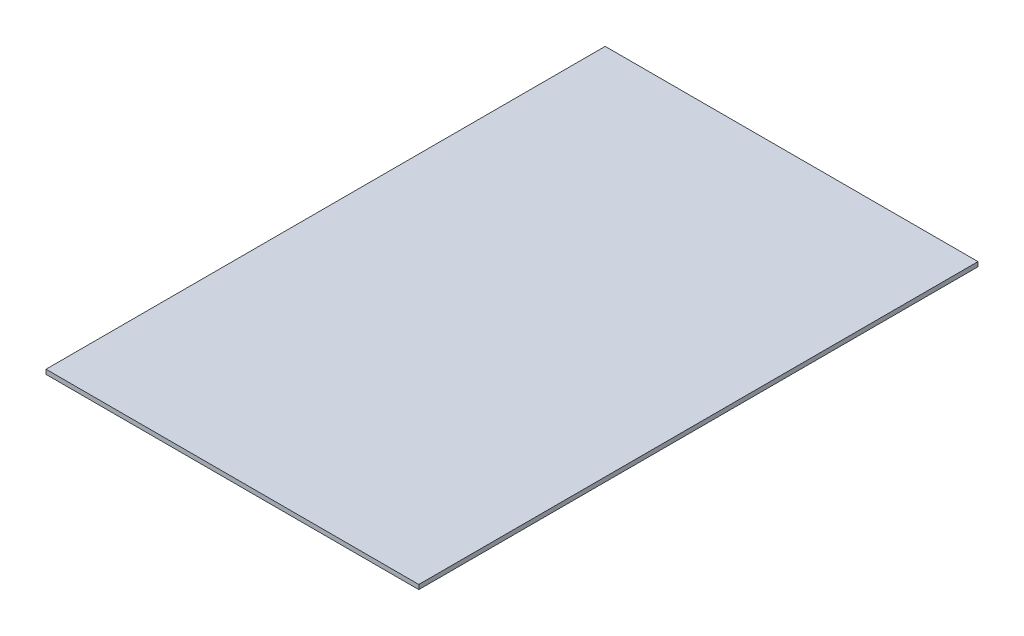
ISO-10303-21;
HEADER;
FILE_DESCRIPTION(('STEP AP214'),'2;1');
FILE_NAME('part.step','',(''),(''),'','','');
FILE_SCHEMA(('AUTOMOTIVE_DESIGN { 1 0 10303 214 1 1 1 1 }'));
ENDSEC;
DATA;
#1=APPLICATION_CONTEXT('core data for automotive mechanical design processes');
#2=APPLICATION_PROTOCOL_DEFINITION('international standard','automotive_design',2000,#1);
#3=PRODUCT_CONTEXT('',#1,'mechanical');
#4=PRODUCT('Part','Part','',(#3));
#5=PRODUCT_RELATED_PRODUCT_CATEGORY('part','',(#4));
#6=PRODUCT_DEFINITION_FORMATION('','',#4);
#7=PRODUCT_DEFINITION_CONTEXT('part definition',#1,'design');
#8=PRODUCT_DEFINITION('design','',#6,#7);
#9=PRODUCT_DEFINITION_SHAPE('','',#8);
#10=(LENGTH_UNIT() NAMED_UNIT(*) SI_UNIT(.MILLI.,.METRE.));
#11=(NAMED_UNIT(*) PLANE_ANGLE_UNIT() SI_UNIT($,.RADIAN.));
#12=(NAMED_UNIT(*) SI_UNIT($,.STERADIAN.) SOLID_ANGLE_UNIT());
#13=UNCERTAINTY_MEASURE_WITH_UNIT(LENGTH_MEASURE(1.E-05),#10,'distance_accuracy_value','');
#14=(GEOMETRIC_REPRESENTATION_CONTEXT(3) GLOBAL_UNCERTAINTY_ASSIGNED_CONTEXT((#13)) GLOBAL_UNIT_ASSIGNED_CONTEXT((#10,
#11,#12)) REPRESENTATION_CONTEXT('',''));
#15=CARTESIAN_POINT('',(0.,0.,0.));
#16=DIRECTION('',(0.,0.,1.));
#17=DIRECTION('',(1.,0.,0.));
#18=AXIS2_PLACEMENT_3D('',#15,#16,#17);
#19=CARTESIAN_POINT('',(0.,4.826,0.));
#20=DIRECTION('',(1.,0.,0.));
#21=DIRECTION('',(0.,0.,-1.));
#22=AXIS2_PLACEMENT_3D('',#19,#20,#21);
#23=PLANE('',#22);
#24=DIRECTION('',(0.,0.,1.));
#25=VECTOR('',#24,1.);
#26=CARTESIAN_POINT('',(0.,0.,0.));
#27=LINE('',#26,#25);
#28=CARTESIAN_POINT('',(0.,0.,0.));
#29=VERTEX_POINT('',#28);
#30=CARTESIAN_POINT('',(0.,0.,600.));
#31=VERTEX_POINT('',#30);
#32=EDGE_CURVE('E105',#29,#31,#27,.T.);
#33=ORIENTED_EDGE('',*,*,#32,.T.);
#34=DIRECTION('',(0.,-1.,0.));
#35=VECTOR('',#34,1.);
#36=CARTESIAN_POINT('',(0.,4.826,600.));
#37=LINE('',#36,#35);
#38=CARTESIAN_POINT('',(0.,4.826,600.));
#39=VERTEX_POINT('',#38);
#40=EDGE_CURVE('E11',#39,#31,#37,.T.);
#41=ORIENTED_EDGE('',*,*,#40,.F.);
#42=DIRECTION('',(0.,0.,1.));
#43=VECTOR('',#42,1.);
#44=CARTESIAN_POINT('',(0.,4.826,0.));
#45=LINE('',#44,#43);
#46=CARTESIAN_POINT('',(0.,4.826,0.));
#47=VERTEX_POINT('',#46);
#48=EDGE_CURVE('E93',#47,#39,#45,.T.);
#49=ORIENTED_EDGE('',*,*,#48,.F.);
#50=DIRECTION('',(0.,-1.,0.));
#51=VECTOR('',#50,1.);
#52=CARTESIAN_POINT('',(0.,4.826,0.));
#53=LINE('',#52,#51);
#54=EDGE_CURVE('E101',#47,#29,#53,.T.);
#55=ORIENTED_EDGE('',*,*,#54,.T.);
#56=EDGE_LOOP('',(#33,#41,#49,#55));
#57=FACE_BOUND('',#56,.T.);
#58=ADVANCED_FACE('F42',(#57),#23,.F.);
#59=CARTESIAN_POINT('',(0.,4.826,600.));
#60=DIRECTION('',(0.,0.,-1.));
#61=DIRECTION('',(-1.,0.,0.));
#62=AXIS2_PLACEMENT_3D('',#59,#60,#61);
#63=PLANE('',#62);
#64=DIRECTION('',(1.,0.,0.));
#65=VECTOR('',#64,1.);
#66=CARTESIAN_POINT('',(0.,0.,600.));
#67=LINE('',#66,#65);
#68=CARTESIAN_POINT('',(400.,0.,600.));
#69=VERTEX_POINT('',#68);
#70=EDGE_CURVE('E97',#31,#69,#67,.T.);
#71=ORIENTED_EDGE('',*,*,#70,.T.);
#72=DIRECTION('',(0.,-1.,0.));
#73=VECTOR('',#72,1.);
#74=CARTESIAN_POINT('',(400.,4.826,600.));
#75=LINE('',#74,#73);
#76=CARTESIAN_POINT('',(400.,4.826,600.));
#77=VERTEX_POINT('',#76);
#78=EDGE_CURVE('E50',#77,#69,#75,.T.);
#79=ORIENTED_EDGE('',*,*,#78,.F.);
#80=DIRECTION('',(1.,0.,0.));
#81=VECTOR('',#80,1.);
#82=CARTESIAN_POINT('',(0.,4.826,600.));
#83=LINE('',#82,#81);
#84=EDGE_CURVE('E88',#39,#77,#83,.T.);
#85=ORIENTED_EDGE('',*,*,#84,.F.);
#86=ORIENTED_EDGE('',*,*,#40,.T.);
#87=EDGE_LOOP('',(#71,#79,#85,#86));
#88=FACE_BOUND('',#87,.T.);
#89=ADVANCED_FACE('F96',(#88),#63,.F.);
#90=CARTESIAN_POINT('',(400.,4.826,0.));
#91=DIRECTION('',(-1.,0.,0.));
#92=DIRECTION('',(0.,0.,1.));
#93=AXIS2_PLACEMENT_3D('',#90,#91,#92);
#94=PLANE('',#93);
#95=DIRECTION('',(0.,0.,-1.));
#96=VECTOR('',#95,1.);
#97=CARTESIAN_POINT('',(400.,0.,0.));
#98=LINE('',#97,#96);
#99=CARTESIAN_POINT('',(400.,0.,0.));
#100=VERTEX_POINT('',#99);
#101=EDGE_CURVE('E75',#69,#100,#98,.T.);
#102=ORIENTED_EDGE('',*,*,#101,.T.);
#103=DIRECTION('',(0.,-1.,0.));
#104=VECTOR('',#103,1.);
#105=CARTESIAN_POINT('',(400.,4.826,0.));
#106=LINE('',#105,#104);
#107=CARTESIAN_POINT('',(400.,4.826,0.));
#108=VERTEX_POINT('',#107);
#109=EDGE_CURVE('E98',#108,#100,#106,.T.);
#110=ORIENTED_EDGE('',*,*,#109,.F.);
#111=DIRECTION('',(0.,0.,-1.));
#112=VECTOR('',#111,1.);
#113=CARTESIAN_POINT('',(400.,4.826,0.));
#114=LINE('',#113,#112);
#115=EDGE_CURVE('E91',#77,#108,#114,.T.);
#116=ORIENTED_EDGE('',*,*,#115,.F.);
#117=ORIENTED_EDGE('',*,*,#78,.T.);
#118=EDGE_LOOP('',(#102,#110,#116,#117));
#119=FACE_BOUND('',#118,.T.);
#120=ADVANCED_FACE('F99',(#119),#94,.F.);
#121=CARTESIAN_POINT('',(0.,4.826,0.));
#122=DIRECTION('',(0.,0.,1.));
#123=DIRECTION('',(1.,0.,0.));
#124=AXIS2_PLACEMENT_3D('',#121,#122,#123);
#125=PLANE('',#124);
#126=DIRECTION('',(-1.,0.,0.));
#127=VECTOR('',#126,1.);
#128=CARTESIAN_POINT('',(0.,0.,0.));
#129=LINE('',#128,#127);
#130=EDGE_CURVE('E81',#100,#29,#129,.T.);
#131=ORIENTED_EDGE('',*,*,#130,.T.);
#132=ORIENTED_EDGE('',*,*,#54,.F.);
#133=DIRECTION('',(-1.,0.,0.));
#134=VECTOR('',#133,1.);
#135=CARTESIAN_POINT('',(0.,4.826,0.));
#136=LINE('',#135,#134);
#137=EDGE_CURVE('E58',#108,#47,#136,.T.);
#138=ORIENTED_EDGE('',*,*,#137,.F.);
#139=ORIENTED_EDGE('',*,*,#109,.T.);
#140=EDGE_LOOP('',(#131,#132,#138,#139));
#141=FACE_BOUND('',#140,.T.);
#142=ADVANCED_FACE('F112',(#141),#125,.F.);
#143=CARTESIAN_POINT('',(0.,4.826,0.));
#144=DIRECTION('',(0.,1.,0.));
#145=DIRECTION('',(0.,0.,1.));
#146=AXIS2_PLACEMENT_3D('',#143,#144,#145);
#147=PLANE('',#146);
#148=ORIENTED_EDGE('',*,*,#48,.T.);
#149=ORIENTED_EDGE('',*,*,#84,.T.);
#150=ORIENTED_EDGE('',*,*,#115,.T.);
#151=ORIENTED_EDGE('',*,*,#137,.T.);
#152=EDGE_LOOP('',(#148,#149,#150,#151));
#153=FACE_BOUND('',#152,.T.);
#154=ADVANCED_FACE('F89',(#153),#147,.T.);
#155=CARTESIAN_POINT('',(0.,0.,0.));
#156=DIRECTION('',(0.,1.,0.));
#157=DIRECTION('',(0.,0.,1.));
#158=AXIS2_PLACEMENT_3D('',#155,#156,#157);
#159=PLANE('',#158);
#160=ORIENTED_EDGE('',*,*,#32,.F.);
#161=ORIENTED_EDGE('',*,*,#130,.F.);
#162=ORIENTED_EDGE('',*,*,#101,.F.);
#163=ORIENTED_EDGE('',*,*,#70,.F.);
#164=EDGE_LOOP('',(#160,#161,#162,#163));
#165=FACE_BOUND('',#164,.T.);
#166=ADVANCED_FACE('F115',(#165),#159,.F.);
#167=CLOSED_SHELL('',(#58,#89,#120,#142,#154,#166));
#168=MANIFOLD_SOLID_BREP('B2',#167);
#169=ADVANCED_BREP_SHAPE_REPRESENTATION('',(#18,#168),#14);
#170=SHAPE_DEFINITION_REPRESENTATION(#9,#169);
ENDSEC;
END-ISO-10303-21;
